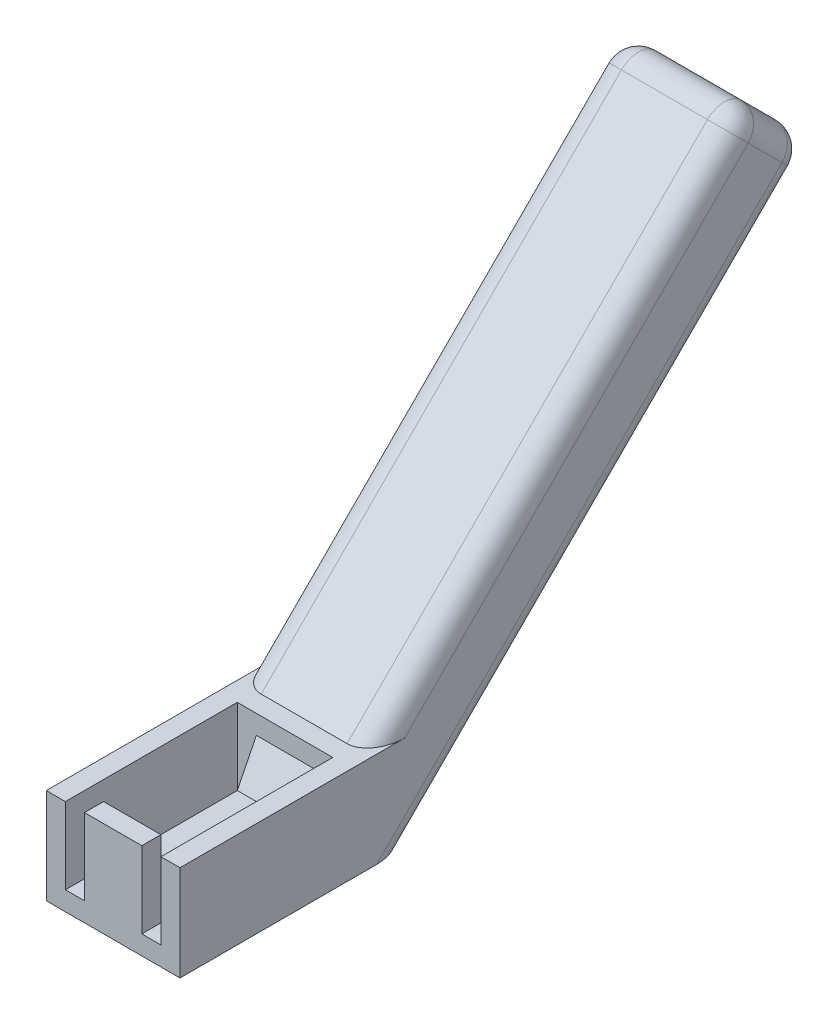
ISO-10303-21;
HEADER;
FILE_DESCRIPTION(('STEP AP214'),'2;1');
FILE_NAME('part.step','',(''),(''),'','','');
FILE_SCHEMA(('AUTOMOTIVE_DESIGN { 1 0 10303 214 1 1 1 1 }'));
ENDSEC;
DATA;
#1=APPLICATION_CONTEXT('core data for automotive mechanical design processes');
#2=APPLICATION_PROTOCOL_DEFINITION('international standard','automotive_design',2000,#1);
#3=PRODUCT_CONTEXT('',#1,'mechanical');
#4=PRODUCT('Part','Part','',(#3));
#5=PRODUCT_RELATED_PRODUCT_CATEGORY('part','',(#4));
#6=PRODUCT_DEFINITION_FORMATION('','',#4);
#7=PRODUCT_DEFINITION_CONTEXT('part definition',#1,'design');
#8=PRODUCT_DEFINITION('design','',#6,#7);
#9=PRODUCT_DEFINITION_SHAPE('','',#8);
#10=(LENGTH_UNIT() NAMED_UNIT(*) SI_UNIT(.MILLI.,.METRE.));
#11=(NAMED_UNIT(*) PLANE_ANGLE_UNIT() SI_UNIT($,.RADIAN.));
#12=(NAMED_UNIT(*) SI_UNIT($,.STERADIAN.) SOLID_ANGLE_UNIT());
#13=UNCERTAINTY_MEASURE_WITH_UNIT(LENGTH_MEASURE(1.E-05),#10,'distance_accuracy_value','');
#14=(GEOMETRIC_REPRESENTATION_CONTEXT(3) GLOBAL_UNCERTAINTY_ASSIGNED_CONTEXT((#13)) GLOBAL_UNIT_ASSIGNED_CONTEXT((#10,
#11,#12)) REPRESENTATION_CONTEXT('',''));
#15=CARTESIAN_POINT('',(0.,0.,0.));
#16=DIRECTION('',(0.,0.,1.));
#17=DIRECTION('',(1.,0.,0.));
#18=AXIS2_PLACEMENT_3D('',#15,#16,#17);
#19=CARTESIAN_POINT('',(-8.75,12.5,5.17766952966368));
#20=DIRECTION('',(0.,1.,0.));
#21=DIRECTION('',(0.,0.,1.));
#22=AXIS2_PLACEMENT_3D('',#19,#20,#21);
#23=PLANE('',#22);
#24=DIRECTION('',(0.,0.,-1.));
#25=VECTOR('',#24,1.);
#26=CARTESIAN_POINT('',(-3.75,12.5,5.17766952966368));
#27=LINE('',#26,#25);
#28=CARTESIAN_POINT('',(-3.75,12.5,30.1776695296637));
#29=VERTEX_POINT('',#28);
#30=CARTESIAN_POINT('',(-3.75,12.5,27.6776695296637));
#31=VERTEX_POINT('',#30);
#32=EDGE_CURVE('E392',#29,#31,#27,.T.);
#33=ORIENTED_EDGE('',*,*,#32,.F.);
#34=DIRECTION('',(1.,0.,0.));
#35=VECTOR('',#34,1.);
#36=CARTESIAN_POINT('',(-8.75,12.5,30.1776695296637));
#37=LINE('',#36,#35);
#38=CARTESIAN_POINT('',(3.75,12.5,30.1776695296637));
#39=VERTEX_POINT('',#38);
#40=EDGE_CURVE('E243',#29,#39,#37,.T.);
#41=ORIENTED_EDGE('',*,*,#40,.T.);
#42=DIRECTION('',(0.,0.,1.));
#43=VECTOR('',#42,1.);
#44=CARTESIAN_POINT('',(3.75,12.5,5.17766952966368));
#45=LINE('',#44,#43);
#46=CARTESIAN_POINT('',(3.75,12.5,27.6776695296637));
#47=VERTEX_POINT('',#46);
#48=EDGE_CURVE('E371',#47,#39,#45,.T.);
#49=ORIENTED_EDGE('',*,*,#48,.F.);
#50=DIRECTION('',(1.,0.,0.));
#51=VECTOR('',#50,1.);
#52=CARTESIAN_POINT('',(-8.75,12.5,27.6776695296637));
#53=LINE('',#52,#51);
#54=EDGE_CURVE('E492',#31,#47,#53,.T.);
#55=ORIENTED_EDGE('',*,*,#54,.F.);
#56=EDGE_LOOP('',(#33,#41,#49,#55));
#57=FACE_BOUND('',#56,.T.);
#58=ADVANCED_FACE('F39',(#57),#23,.T.);
#59=CARTESIAN_POINT('',(-8.75,2.5,7.67766952966368));
#60=DIRECTION('',(0.,1.,0.));
#61=DIRECTION('',(0.,0.,1.));
#62=AXIS2_PLACEMENT_3D('',#59,#60,#61);
#63=PLANE('',#62);
#64=DIRECTION('',(0.,0.,-1.));
#65=VECTOR('',#64,1.);
#66=CARTESIAN_POINT('',(6.25,2.5,7.67766952966368));
#67=LINE('',#66,#65);
#68=CARTESIAN_POINT('',(6.25,2.5,30.1776695296637));
#69=VERTEX_POINT('',#68);
#70=CARTESIAN_POINT('',(6.25,2.5,7.67766952966368));
#71=VERTEX_POINT('',#70);
#72=EDGE_CURVE('E416',#69,#71,#67,.T.);
#73=ORIENTED_EDGE('',*,*,#72,.T.);
#74=DIRECTION('',(1.,0.,0.));
#75=VECTOR('',#74,1.);
#76=CARTESIAN_POINT('',(-8.75,2.5,7.67766952966368));
#77=LINE('',#76,#75);
#78=CARTESIAN_POINT('',(-6.25,2.5,7.67766952966368));
#79=VERTEX_POINT('',#78);
#80=EDGE_CURVE('E457',#79,#71,#77,.T.);
#81=ORIENTED_EDGE('',*,*,#80,.F.);
#82=DIRECTION('',(0.,0.,1.));
#83=VECTOR('',#82,1.);
#84=CARTESIAN_POINT('',(-6.25,2.5,7.67766952966368));
#85=LINE('',#84,#83);
#86=CARTESIAN_POINT('',(-6.25,2.5,30.1776695296637));
#87=VERTEX_POINT('',#86);
#88=EDGE_CURVE('E232',#79,#87,#85,.T.);
#89=ORIENTED_EDGE('',*,*,#88,.T.);
#90=DIRECTION('',(-1.,0.,0.));
#91=VECTOR('',#90,1.);
#92=CARTESIAN_POINT('',(-8.75,2.5,30.1776695296637));
#93=LINE('',#92,#91);
#94=CARTESIAN_POINT('',(-3.75,2.5,30.1776695296637));
#95=VERTEX_POINT('',#94);
#96=EDGE_CURVE('E224',#95,#87,#93,.T.);
#97=ORIENTED_EDGE('',*,*,#96,.F.);
#98=DIRECTION('',(0.,0.,1.));
#99=VECTOR('',#98,1.);
#100=CARTESIAN_POINT('',(-3.75,2.5,7.67766952966368));
#101=LINE('',#100,#99);
#102=CARTESIAN_POINT('',(-3.75,2.5,27.6776695296637));
#103=VERTEX_POINT('',#102);
#104=EDGE_CURVE('E212',#103,#95,#101,.T.);
#105=ORIENTED_EDGE('',*,*,#104,.F.);
#106=DIRECTION('',(1.,0.,0.));
#107=VECTOR('',#106,1.);
#108=CARTESIAN_POINT('',(-8.75,2.5,27.6776695296637));
#109=LINE('',#108,#107);
#110=CARTESIAN_POINT('',(3.75,2.5,27.6776695296637));
#111=VERTEX_POINT('',#110);
#112=EDGE_CURVE('E456',#103,#111,#109,.T.);
#113=ORIENTED_EDGE('',*,*,#112,.T.);
#114=DIRECTION('',(0.,0.,-1.));
#115=VECTOR('',#114,1.);
#116=CARTESIAN_POINT('',(3.75,2.5,7.67766952966367));
#117=LINE('',#116,#115);
#118=CARTESIAN_POINT('',(3.75,2.5,30.1776695296637));
#119=VERTEX_POINT('',#118);
#120=EDGE_CURVE('E355',#119,#111,#117,.T.);
#121=ORIENTED_EDGE('',*,*,#120,.F.);
#122=DIRECTION('',(-1.,0.,0.));
#123=VECTOR('',#122,1.);
#124=CARTESIAN_POINT('',(-8.75000000000003,2.5,30.1776695296637));
#125=LINE('',#124,#123);
#126=EDGE_CURVE('E358',#69,#119,#125,.T.);
#127=ORIENTED_EDGE('',*,*,#126,.F.);
#128=EDGE_LOOP('',(#73,#81,#89,#97,#105,#113,#121,#127));
#129=FACE_BOUND('',#128,.T.);
#130=ADVANCED_FACE('F229',(#129),#63,.T.);
#131=CARTESIAN_POINT('',(-8.75,5.,10.1776695296637));
#132=DIRECTION('',(0.,-1.,0.));
#133=DIRECTION('',(0.,0.,-1.));
#134=AXIS2_PLACEMENT_3D('',#131,#132,#133);
#135=PLANE('',#134);
#136=DIRECTION('',(0.,0.,1.));
#137=VECTOR('',#136,1.);
#138=CARTESIAN_POINT('',(-3.75,5.,10.1776695296637));
#139=LINE('',#138,#137);
#140=CARTESIAN_POINT('',(-3.75,5.00000000000001,7.67766952966368));
#141=VERTEX_POINT('',#140);
#142=CARTESIAN_POINT('',(-3.75,5.,10.1776695296637));
#143=VERTEX_POINT('',#142);
#144=EDGE_CURVE('E409',#141,#143,#139,.T.);
#145=ORIENTED_EDGE('',*,*,#144,.F.);
#146=DIRECTION('',(1.,0.,0.));
#147=VECTOR('',#146,1.);
#148=CARTESIAN_POINT('',(-8.75,5.,7.67766952966368));
#149=LINE('',#148,#147);
#150=CARTESIAN_POINT('',(3.75,5.00000000000001,7.67766952966368));
#151=VERTEX_POINT('',#150);
#152=EDGE_CURVE('E461',#141,#151,#149,.T.);
#153=ORIENTED_EDGE('',*,*,#152,.T.);
#154=DIRECTION('',(0.,0.,-1.));
#155=VECTOR('',#154,1.);
#156=CARTESIAN_POINT('',(3.75,5.,10.1776695296637));
#157=LINE('',#156,#155);
#158=CARTESIAN_POINT('',(3.75,5.,10.1776695296637));
#159=VERTEX_POINT('',#158);
#160=EDGE_CURVE('E389',#159,#151,#157,.T.);
#161=ORIENTED_EDGE('',*,*,#160,.F.);
#162=DIRECTION('',(1.,0.,0.));
#163=VECTOR('',#162,1.);
#164=CARTESIAN_POINT('',(-8.75,5.,10.1776695296637));
#165=LINE('',#164,#163);
#166=EDGE_CURVE('E465',#143,#159,#165,.T.);
#167=ORIENTED_EDGE('',*,*,#166,.F.);
#168=EDGE_LOOP('',(#145,#153,#161,#167));
#169=FACE_BOUND('',#168,.T.);
#170=ADVANCED_FACE('F608',(#169),#135,.T.);
#171=CARTESIAN_POINT('',(-8.75,5.,10.1776695296637));
#172=DIRECTION('',(0.,0.447213595499958,0.894427190999916));
#173=DIRECTION('',(0.,-0.894427190999916,0.447213595499958));
#174=AXIS2_PLACEMENT_3D('',#171,#172,#173);
#175=PLANE('',#174);
#176=DIRECTION('',(0.,0.894427190999916,-0.447213595499958));
#177=VECTOR('',#176,1.);
#178=CARTESIAN_POINT('',(-3.75,5.,10.1776695296637));
#179=LINE('',#178,#177);
#180=CARTESIAN_POINT('',(-3.75,10.,7.67766952966368));
#181=VERTEX_POINT('',#180);
#182=EDGE_CURVE('E406',#143,#181,#179,.T.);
#183=ORIENTED_EDGE('',*,*,#182,.F.);
#184=ORIENTED_EDGE('',*,*,#166,.T.);
#185=DIRECTION('',(0.,-0.894427190999916,0.447213595499958));
#186=VECTOR('',#185,1.);
#187=CARTESIAN_POINT('',(3.75,5.,10.1776695296637));
#188=LINE('',#187,#186);
#189=CARTESIAN_POINT('',(3.75,10.,7.67766952966368));
#190=VERTEX_POINT('',#189);
#191=EDGE_CURVE('E386',#190,#159,#188,.T.);
#192=ORIENTED_EDGE('',*,*,#191,.F.);
#193=DIRECTION('',(1.,0.,0.));
#194=VECTOR('',#193,1.);
#195=CARTESIAN_POINT('',(-8.75,10.,7.67766952966368));
#196=LINE('',#195,#194);
#197=EDGE_CURVE('E469',#181,#190,#196,.T.);
#198=ORIENTED_EDGE('',*,*,#197,.F.);
#199=EDGE_LOOP('',(#183,#184,#192,#198));
#200=FACE_BOUND('',#199,.T.);
#201=ADVANCED_FACE('F778',(#200),#175,.T.);
#202=CARTESIAN_POINT('',(-8.75,12.5,7.67766952966367));
#203=DIRECTION('',(0.,0.,1.));
#204=DIRECTION('',(0.,-1.,0.));
#205=AXIS2_PLACEMENT_3D('',#202,#203,#204);
#206=PLANE('',#205);
#207=ORIENTED_EDGE('',*,*,#152,.F.);
#208=DIRECTION('',(0.,-1.,0.));
#209=VECTOR('',#208,1.);
#210=CARTESIAN_POINT('',(-3.75,61.871843353823,7.67766952966368));
#211=LINE('',#210,#209);
#212=EDGE_CURVE('E237',#181,#141,#211,.T.);
#213=ORIENTED_EDGE('',*,*,#212,.F.);
#214=ORIENTED_EDGE('',*,*,#197,.T.);
#215=DIRECTION('',(0.,-1.,0.));
#216=VECTOR('',#215,1.);
#217=CARTESIAN_POINT('',(3.75,61.871843353823,7.67766952966368));
#218=LINE('',#217,#216);
#219=EDGE_CURVE('E225',#190,#151,#218,.T.);
#220=ORIENTED_EDGE('',*,*,#219,.T.);
#221=EDGE_LOOP('',(#207,#213,#214,#220));
#222=FACE_BOUND('',#221,.T.);
#223=DIRECTION('',(0.,1.,0.));
#224=VECTOR('',#223,1.);
#225=CARTESIAN_POINT('',(6.25,12.5,7.67766952966367));
#226=LINE('',#225,#224);
#227=CARTESIAN_POINT('',(6.25,12.5,7.67766952966367));
#228=VERTEX_POINT('',#227);
#229=EDGE_CURVE('E419',#71,#228,#226,.T.);
#230=ORIENTED_EDGE('',*,*,#229,.T.);
#231=DIRECTION('',(1.,0.,0.));
#232=VECTOR('',#231,1.);
#233=CARTESIAN_POINT('',(-8.75,12.5,7.67766952966367));
#234=LINE('',#233,#232);
#235=CARTESIAN_POINT('',(-6.25,12.5,7.67766952966367));
#236=VERTEX_POINT('',#235);
#237=EDGE_CURVE('E473',#236,#228,#234,.T.);
#238=ORIENTED_EDGE('',*,*,#237,.F.);
#239=DIRECTION('',(0.,-1.,0.));
#240=VECTOR('',#239,1.);
#241=CARTESIAN_POINT('',(-6.25,12.5,7.67766952966367));
#242=LINE('',#241,#240);
#243=EDGE_CURVE('E429',#236,#79,#242,.T.);
#244=ORIENTED_EDGE('',*,*,#243,.T.);
#245=ORIENTED_EDGE('',*,*,#80,.T.);
#246=EDGE_LOOP('',(#230,#238,#244,#245));
#247=FACE_BOUND('',#246,.T.);
#248=ADVANCED_FACE('F772',(#222,#247),#206,.T.);
#249=CARTESIAN_POINT('',(-8.75,10.,27.6776695296637));
#250=DIRECTION('',(0.,0.,-1.));
#251=DIRECTION('',(-1.,0.,0.));
#252=AXIS2_PLACEMENT_3D('',#249,#250,#251);
#253=PLANE('',#252);
#254=DIRECTION('',(0.,-1.,0.));
#255=VECTOR('',#254,1.);
#256=CARTESIAN_POINT('',(-3.75,10.,27.6776695296637));
#257=LINE('',#256,#255);
#258=CARTESIAN_POINT('',(-3.75,10.,27.6776695296637));
#259=VERTEX_POINT('',#258);
#260=EDGE_CURVE('E395',#31,#259,#257,.T.);
#261=ORIENTED_EDGE('',*,*,#260,.F.);
#262=ORIENTED_EDGE('',*,*,#54,.T.);
#263=DIRECTION('',(0.,1.,0.));
#264=VECTOR('',#263,1.);
#265=CARTESIAN_POINT('',(3.75,10.,27.6776695296637));
#266=LINE('',#265,#264);
#267=CARTESIAN_POINT('',(3.75,10.,27.6776695296637));
#268=VERTEX_POINT('',#267);
#269=EDGE_CURVE('E374',#268,#47,#266,.T.);
#270=ORIENTED_EDGE('',*,*,#269,.F.);
#271=DIRECTION('',(1.,0.,0.));
#272=VECTOR('',#271,1.);
#273=CARTESIAN_POINT('',(-8.75,10.,27.6776695296637));
#274=LINE('',#273,#272);
#275=EDGE_CURVE('E496',#259,#268,#274,.T.);
#276=ORIENTED_EDGE('',*,*,#275,.F.);
#277=EDGE_LOOP('',(#261,#262,#270,#276));
#278=FACE_BOUND('',#277,.T.);
#279=ADVANCED_FACE('F534',(#278),#253,.T.);
#280=CARTESIAN_POINT('',(-8.75,5.,25.1776695296637));
#281=DIRECTION('',(0.,0.447213595499958,-0.894427190999916));
#282=DIRECTION('',(0.,0.894427190999916,0.447213595499958));
#283=AXIS2_PLACEMENT_3D('',#280,#281,#282);
#284=PLANE('',#283);
#285=DIRECTION('',(0.,-0.894427190999916,-0.447213595499958));
#286=VECTOR('',#285,1.);
#287=CARTESIAN_POINT('',(-3.75,5.,25.1776695296637));
#288=LINE('',#287,#286);
#289=CARTESIAN_POINT('',(-3.75,5.,25.1776695296637));
#290=VERTEX_POINT('',#289);
#291=EDGE_CURVE('E398',#259,#290,#288,.T.);
#292=ORIENTED_EDGE('',*,*,#291,.F.);
#293=ORIENTED_EDGE('',*,*,#275,.T.);
#294=DIRECTION('',(0.,0.894427190999916,0.447213595499958));
#295=VECTOR('',#294,1.);
#296=CARTESIAN_POINT('',(3.75,5.,25.1776695296637));
#297=LINE('',#296,#295);
#298=CARTESIAN_POINT('',(3.75,5.,25.1776695296637));
#299=VERTEX_POINT('',#298);
#300=EDGE_CURVE('E377',#299,#268,#297,.T.);
#301=ORIENTED_EDGE('',*,*,#300,.F.);
#302=DIRECTION('',(1.,0.,0.));
#303=VECTOR('',#302,1.);
#304=CARTESIAN_POINT('',(-8.75,5.,25.1776695296637));
#305=LINE('',#304,#303);
#306=EDGE_CURVE('E500',#290,#299,#305,.T.);
#307=ORIENTED_EDGE('',*,*,#306,.F.);
#308=EDGE_LOOP('',(#292,#293,#301,#307));
#309=FACE_BOUND('',#308,.T.);
#310=ADVANCED_FACE('F529',(#309),#284,.T.);
#311=CARTESIAN_POINT('',(-8.75,5.,27.6776695296637));
#312=DIRECTION('',(0.,-1.,0.));
#313=DIRECTION('',(0.,0.,-1.));
#314=AXIS2_PLACEMENT_3D('',#311,#312,#313);
#315=PLANE('',#314);
#316=DIRECTION('',(0.,0.,1.));
#317=VECTOR('',#316,1.);
#318=CARTESIAN_POINT('',(-3.75,5.,27.6776695296637));
#319=LINE('',#318,#317);
#320=CARTESIAN_POINT('',(-3.75,5.,27.6776695296637));
#321=VERTEX_POINT('',#320);
#322=EDGE_CURVE('E401',#290,#321,#319,.T.);
#323=ORIENTED_EDGE('',*,*,#322,.F.);
#324=ORIENTED_EDGE('',*,*,#306,.T.);
#325=DIRECTION('',(0.,0.,-1.));
#326=VECTOR('',#325,1.);
#327=CARTESIAN_POINT('',(3.75,5.,27.6776695296637));
#328=LINE('',#327,#326);
#329=CARTESIAN_POINT('',(3.75,5.,27.6776695296637));
#330=VERTEX_POINT('',#329);
#331=EDGE_CURVE('E380',#330,#299,#328,.T.);
#332=ORIENTED_EDGE('',*,*,#331,.F.);
#333=DIRECTION('',(1.,0.,0.));
#334=VECTOR('',#333,1.);
#335=CARTESIAN_POINT('',(-8.75,5.,27.6776695296637));
#336=LINE('',#335,#334);
#337=EDGE_CURVE('E504',#321,#330,#336,.T.);
#338=ORIENTED_EDGE('',*,*,#337,.F.);
#339=EDGE_LOOP('',(#323,#324,#332,#338));
#340=FACE_BOUND('',#339,.T.);
#341=ADVANCED_FACE('F525',(#340),#315,.T.);
#342=CARTESIAN_POINT('',(-8.75,2.5,27.6776695296637));
#343=DIRECTION('',(0.,0.,-1.));
#344=DIRECTION('',(-1.,0.,0.));
#345=AXIS2_PLACEMENT_3D('',#342,#343,#344);
#346=PLANE('',#345);
#347=DIRECTION('',(0.,-1.,0.));
#348=VECTOR('',#347,1.);
#349=CARTESIAN_POINT('',(-3.75,2.5,27.6776695296637));
#350=LINE('',#349,#348);
#351=EDGE_CURVE('E219',#321,#103,#350,.T.);
#352=ORIENTED_EDGE('',*,*,#351,.F.);
#353=ORIENTED_EDGE('',*,*,#337,.T.);
#354=DIRECTION('',(0.,1.,0.));
#355=VECTOR('',#354,1.);
#356=CARTESIAN_POINT('',(3.75,2.5,27.6776695296637));
#357=LINE('',#356,#355);
#358=EDGE_CURVE('E383',#111,#330,#357,.T.);
#359=ORIENTED_EDGE('',*,*,#358,.F.);
#360=ORIENTED_EDGE('',*,*,#112,.F.);
#361=EDGE_LOOP('',(#352,#353,#359,#360));
#362=FACE_BOUND('',#361,.T.);
#363=ADVANCED_FACE('F519',(#362),#346,.T.);
#364=CARTESIAN_POINT('',(-8.75,12.5,30.1776695296637));
#365=VERTEX_POINT('',#364);
#366=CARTESIAN_POINT('',(-6.25,12.5,30.1776695296637));
#367=VERTEX_POINT('',#366);
#368=EDGE_CURVE('E487',#365,#367,#37,.T.);
#369=ORIENTED_EDGE('',*,*,#368,.T.);
#370=DIRECTION('',(0.,0.,-1.));
#371=VECTOR('',#370,1.);
#372=CARTESIAN_POINT('',(-6.25,12.5,42.9252183136456));
#373=LINE('',#372,#371);
#374=EDGE_CURVE('E423',#367,#236,#373,.T.);
#375=ORIENTED_EDGE('',*,*,#374,.T.);
#376=ORIENTED_EDGE('',*,*,#237,.T.);
#377=DIRECTION('',(0.,0.,-1.));
#378=VECTOR('',#377,1.);
#379=CARTESIAN_POINT('',(6.25,12.5,42.9252183136456));
#380=LINE('',#379,#378);
#381=CARTESIAN_POINT('',(6.25,12.5,30.1776695296637));
#382=VERTEX_POINT('',#381);
#383=EDGE_CURVE('E412',#382,#228,#380,.T.);
#384=ORIENTED_EDGE('',*,*,#383,.F.);
#385=CARTESIAN_POINT('',(8.75,12.5,30.1776695296637));
#386=VERTEX_POINT('',#385);
#387=EDGE_CURVE('E491',#382,#386,#37,.T.);
#388=ORIENTED_EDGE('',*,*,#387,.T.);
#389=DIRECTION('',(0.,0.,1.));
#390=VECTOR('',#389,1.);
#391=CARTESIAN_POINT('',(8.75,12.5,27.6776695296637));
#392=LINE('',#391,#390);
#393=CARTESIAN_POINT('',(8.75,12.5,0.758252147247746));
#394=VERTEX_POINT('',#393);
#395=EDGE_CURVE('E432',#394,#386,#392,.T.);
#396=ORIENTED_EDGE('',*,*,#395,.F.);
#397=CARTESIAN_POINT('',(5.625,12.5,0.758252147247753));
#398=DIRECTION('',(0.,1.,0.));
#399=DIRECTION('',(0.,0.,-1.));
#400=AXIS2_PLACEMENT_3D('',#397,#398,#399);
#401=ELLIPSE('',#400,4.41941738241592,3.125);
#402=CARTESIAN_POINT('',(5.625,12.5,5.17766952966368));
#403=VERTEX_POINT('',#402);
#404=EDGE_CURVE('E11',#394,#403,#401,.F.);
#405=ORIENTED_EDGE('',*,*,#404,.T.);
#406=DIRECTION('',(1.,0.,0.));
#407=VECTOR('',#406,1.);
#408=CARTESIAN_POINT('',(-8.75,12.5,5.17766952966368));
#409=LINE('',#408,#407);
#410=CARTESIAN_POINT('',(-5.625,12.5,5.17766952966368));
#411=VERTEX_POINT('',#410);
#412=EDGE_CURVE('E476',#411,#403,#409,.T.);
#413=ORIENTED_EDGE('',*,*,#412,.F.);
#414=CARTESIAN_POINT('',(-5.625,12.5,0.758252147247763));
#415=DIRECTION('',(0.,1.,0.));
#416=DIRECTION('',(0.,0.,1.));
#417=AXIS2_PLACEMENT_3D('',#414,#415,#416);
#418=ELLIPSE('',#417,4.41941738241592,3.125);
#419=CARTESIAN_POINT('',(-8.75,12.5,0.758252147247757));
#420=VERTEX_POINT('',#419);
#421=EDGE_CURVE('E49',#411,#420,#418,.F.);
#422=ORIENTED_EDGE('',*,*,#421,.T.);
#423=DIRECTION('',(0.,0.,1.));
#424=VECTOR('',#423,1.);
#425=CARTESIAN_POINT('',(-8.75,12.5,27.6776695296637));
#426=LINE('',#425,#424);
#427=EDGE_CURVE('E444',#420,#365,#426,.T.);
#428=ORIENTED_EDGE('',*,*,#427,.T.);
#429=EDGE_LOOP('',(#369,#375,#376,#384,#388,#396,#405,#413,#422,#428));
#430=FACE_BOUND('',#429,.T.);
#431=ADVANCED_FACE('F540',(#430),#23,.T.);
#432=CARTESIAN_POINT('',(-8.75,61.871843353823,-44.1941738241591));
#433=DIRECTION('',(0.,0.707106781186546,0.707106781186549));
#434=DIRECTION('',(0.,-0.707106781186549,0.707106781186546));
#435=AXIS2_PLACEMENT_3D('',#432,#433,#434);
#436=PLANE('',#435);
#437=DIRECTION('',(1.,0.,0.));
#438=VECTOR('',#437,1.);
#439=CARTESIAN_POINT('',(-8.75,59.662134662615,-41.9844651329511));
#440=LINE('',#439,#438);
#441=CARTESIAN_POINT('',(5.625,59.662134662615,-41.9844651329511));
#442=VERTEX_POINT('',#441);
#443=CARTESIAN_POINT('',(-5.625,59.662134662615,-41.9844651329511));
#444=VERTEX_POINT('',#443);
#445=EDGE_CURVE('E268',#442,#444,#440,.F.);
#446=ORIENTED_EDGE('',*,*,#445,.T.);
#447=DIRECTION('',(0.,-0.707106781186549,0.707106781186546));
#448=VECTOR('',#447,1.);
#449=CARTESIAN_POINT('',(-5.625,61.871843353823,-44.1941738241591));
#450=LINE('',#449,#448);
#451=EDGE_CURVE('E272',#444,#411,#450,.T.);
#452=ORIENTED_EDGE('',*,*,#451,.T.);
#453=ORIENTED_EDGE('',*,*,#412,.T.);
#454=DIRECTION('',(0.,-0.707106781186549,0.707106781186546));
#455=VECTOR('',#454,1.);
#456=CARTESIAN_POINT('',(5.625,61.871843353823,-44.1941738241591));
#457=LINE('',#456,#455);
#458=EDGE_CURVE('E265',#403,#442,#457,.F.);
#459=ORIENTED_EDGE('',*,*,#458,.T.);
#460=EDGE_LOOP('',(#446,#452,#453,#459));
#461=FACE_BOUND('',#460,.T.);
#462=ADVANCED_FACE('F583',(#461),#436,.T.);
#463=CARTESIAN_POINT('',(-8.75,53.0330085889912,-53.033008588991));
#464=DIRECTION('',(0.,0.70710678118655,-0.707106781186546));
#465=DIRECTION('',(0.,0.707106781186546,0.70710678118655));
#466=AXIS2_PLACEMENT_3D('',#463,#464,#465);
#467=PLANE('',#466);
#468=DIRECTION('',(0.,0.707106781186546,0.70710678118655));
#469=VECTOR('',#468,1.);
#470=CARTESIAN_POINT('',(-5.625,53.0330085889912,-53.033008588991));
#471=LINE('',#470,#469);
#472=CARTESIAN_POINT('',(-5.625,55.2427172801991,-50.823299897783));
#473=VERTEX_POINT('',#472);
#474=CARTESIAN_POINT('',(-5.625,59.662134662615,-46.4038825153671));
#475=VERTEX_POINT('',#474);
#476=EDGE_CURVE('E250',#473,#475,#471,.T.);
#477=ORIENTED_EDGE('',*,*,#476,.T.);
#478=DIRECTION('',(1.,0.,0.));
#479=VECTOR('',#478,1.);
#480=CARTESIAN_POINT('',(-8.75,59.662134662615,-46.4038825153671));
#481=LINE('',#480,#479);
#482=CARTESIAN_POINT('',(5.625,59.662134662615,-46.4038825153671));
#483=VERTEX_POINT('',#482);
#484=EDGE_CURVE('E261',#475,#483,#481,.T.);
#485=ORIENTED_EDGE('',*,*,#484,.T.);
#486=DIRECTION('',(0.,0.707106781186546,0.70710678118655));
#487=VECTOR('',#486,1.);
#488=CARTESIAN_POINT('',(5.625,53.0330085889912,-53.033008588991));
#489=LINE('',#488,#487);
#490=CARTESIAN_POINT('',(5.625,55.2427172801991,-50.823299897783));
#491=VERTEX_POINT('',#490);
#492=EDGE_CURVE('E258',#483,#491,#489,.F.);
#493=ORIENTED_EDGE('',*,*,#492,.T.);
#494=DIRECTION('',(1.,0.,0.));
#495=VECTOR('',#494,1.);
#496=CARTESIAN_POINT('',(-8.75,55.2427172801991,-50.823299897783));
#497=LINE('',#496,#495);
#498=EDGE_CURVE('E245',#491,#473,#497,.F.);
#499=ORIENTED_EDGE('',*,*,#498,.T.);
#500=EDGE_LOOP('',(#477,#485,#493,#499));
#501=FACE_BOUND('',#500,.T.);
#502=ADVANCED_FACE('F617',(#501),#467,.T.);
#503=CARTESIAN_POINT('',(-8.75,0.,0.));
#504=DIRECTION('',(0.,-0.707106781186546,-0.707106781186549));
#505=DIRECTION('',(0.,0.707106781186549,-0.707106781186546));
#506=AXIS2_PLACEMENT_3D('',#503,#504,#505);
#507=PLANE('',#506);
#508=DIRECTION('',(1.,0.,0.));
#509=VECTOR('',#508,1.);
#510=CARTESIAN_POINT('',(-8.75,50.8232998977832,-50.823299897783));
#511=LINE('',#510,#509);
#512=CARTESIAN_POINT('',(-5.625,50.8232998977832,-50.823299897783));
#513=VERTEX_POINT('',#512);
#514=CARTESIAN_POINT('',(5.625,50.8232998977832,-50.823299897783));
#515=VERTEX_POINT('',#514);
#516=EDGE_CURVE('E57',#513,#515,#511,.T.);
#517=ORIENTED_EDGE('',*,*,#516,.T.);
#518=DIRECTION('',(0.,0.707106781186549,-0.707106781186546));
#519=VECTOR('',#518,1.);
#520=CARTESIAN_POINT('',(5.625,0.,0.));
#521=LINE('',#520,#519);
#522=CARTESIAN_POINT('',(5.625,0.,0.));
#523=VERTEX_POINT('',#522);
#524=EDGE_CURVE('E298',#515,#523,#521,.F.);
#525=ORIENTED_EDGE('',*,*,#524,.T.);
#526=DIRECTION('',(1.,0.,0.));
#527=VECTOR('',#526,1.);
#528=CARTESIAN_POINT('',(-8.75,0.,0.));
#529=LINE('',#528,#527);
#530=CARTESIAN_POINT('',(-5.625,0.,0.));
#531=VERTEX_POINT('',#530);
#532=EDGE_CURVE('E480',#531,#523,#529,.T.);
#533=ORIENTED_EDGE('',*,*,#532,.F.);
#534=DIRECTION('',(0.,0.707106781186549,-0.707106781186546));
#535=VECTOR('',#534,1.);
#536=CARTESIAN_POINT('',(-5.625,0.,0.));
#537=LINE('',#536,#535);
#538=EDGE_CURVE('E62',#531,#513,#537,.T.);
#539=ORIENTED_EDGE('',*,*,#538,.T.);
#540=EDGE_LOOP('',(#517,#525,#533,#539));
#541=FACE_BOUND('',#540,.T.);
#542=ADVANCED_FACE('F558',(#541),#507,.T.);
#543=CARTESIAN_POINT('',(-8.75,0.,30.1776695296637));
#544=DIRECTION('',(0.,-1.,0.));
#545=DIRECTION('',(0.,0.,-1.));
#546=AXIS2_PLACEMENT_3D('',#543,#544,#545);
#547=PLANE('',#546);
#548=ORIENTED_EDGE('',*,*,#532,.T.);
#549=CARTESIAN_POINT('',(5.625,0.,4.41941738241591));
#550=DIRECTION('',(0.,-1.,0.));
#551=DIRECTION('',(0.,0.,1.));
#552=AXIS2_PLACEMENT_3D('',#549,#550,#551);
#553=ELLIPSE('',#552,4.41941738241591,3.125);
#554=CARTESIAN_POINT('',(8.75,0.,4.41941738241591));
#555=VERTEX_POINT('',#554);
#556=EDGE_CURVE('E304',#523,#555,#553,.T.);
#557=ORIENTED_EDGE('',*,*,#556,.T.);
#558=DIRECTION('',(0.,0.,-1.));
#559=VECTOR('',#558,1.);
#560=CARTESIAN_POINT('',(8.75,0.,30.1776695296637));
#561=LINE('',#560,#559);
#562=CARTESIAN_POINT('',(8.75,0.,30.1776695296637));
#563=VERTEX_POINT('',#562);
#564=EDGE_CURVE('E440',#563,#555,#561,.T.);
#565=ORIENTED_EDGE('',*,*,#564,.F.);
#566=DIRECTION('',(1.,0.,0.));
#567=VECTOR('',#566,1.);
#568=CARTESIAN_POINT('',(-8.75,0.,30.1776695296637));
#569=LINE('',#568,#567);
#570=CARTESIAN_POINT('',(-8.75,0.,30.1776695296637));
#571=VERTEX_POINT('',#570);
#572=EDGE_CURVE('E484',#571,#563,#569,.T.);
#573=ORIENTED_EDGE('',*,*,#572,.F.);
#574=DIRECTION('',(0.,0.,-1.));
#575=VECTOR('',#574,1.);
#576=CARTESIAN_POINT('',(-8.75,0.,30.1776695296637));
#577=LINE('',#576,#575);
#578=CARTESIAN_POINT('',(-8.75,0.,4.41941738241591));
#579=VERTEX_POINT('',#578);
#580=EDGE_CURVE('E452',#571,#579,#577,.T.);
#581=ORIENTED_EDGE('',*,*,#580,.T.);
#582=CARTESIAN_POINT('',(-5.625,0.,4.41941738241591));
#583=DIRECTION('',(0.,-1.,0.));
#584=DIRECTION('',(0.,0.,-1.));
#585=AXIS2_PLACEMENT_3D('',#582,#583,#584);
#586=ELLIPSE('',#585,4.41941738241591,3.125);
#587=EDGE_CURVE('E301',#579,#531,#586,.T.);
#588=ORIENTED_EDGE('',*,*,#587,.T.);
#589=EDGE_LOOP('',(#548,#557,#565,#573,#581,#588));
#590=FACE_BOUND('',#589,.T.);
#591=ADVANCED_FACE('F550',(#590),#547,.T.);
#592=CARTESIAN_POINT('',(-8.75,12.5,30.1776695296637));
#593=DIRECTION('',(0.,0.,1.));
#594=DIRECTION('',(0.,-1.,0.));
#595=AXIS2_PLACEMENT_3D('',#592,#593,#594);
#596=PLANE('',#595);
#597=DIRECTION('',(0.,1.,0.));
#598=VECTOR('',#597,1.);
#599=CARTESIAN_POINT('',(-3.75,12.5,30.1776695296637));
#600=LINE('',#599,#598);
#601=EDGE_CURVE('E216',#95,#29,#600,.T.);
#602=ORIENTED_EDGE('',*,*,#601,.F.);
#603=ORIENTED_EDGE('',*,*,#96,.T.);
#604=DIRECTION('',(0.,-1.,0.));
#605=VECTOR('',#604,1.);
#606=CARTESIAN_POINT('',(-6.25,12.5,30.1776695296637));
#607=LINE('',#606,#605);
#608=EDGE_CURVE('E246',#367,#87,#607,.T.);
#609=ORIENTED_EDGE('',*,*,#608,.F.);
#610=ORIENTED_EDGE('',*,*,#368,.F.);
#611=DIRECTION('',(0.,-1.,0.));
#612=VECTOR('',#611,1.);
#613=CARTESIAN_POINT('',(-8.75,12.5,30.1776695296637));
#614=LINE('',#613,#612);
#615=EDGE_CURVE('E448',#365,#571,#614,.T.);
#616=ORIENTED_EDGE('',*,*,#615,.T.);
#617=ORIENTED_EDGE('',*,*,#572,.T.);
#618=DIRECTION('',(0.,-1.,0.));
#619=VECTOR('',#618,1.);
#620=CARTESIAN_POINT('',(8.75,12.5,30.1776695296637));
#621=LINE('',#620,#619);
#622=EDGE_CURVE('E436',#386,#563,#621,.T.);
#623=ORIENTED_EDGE('',*,*,#622,.F.);
#624=ORIENTED_EDGE('',*,*,#387,.F.);
#625=DIRECTION('',(0.,1.,0.));
#626=VECTOR('',#625,1.);
#627=CARTESIAN_POINT('',(6.25,12.5,30.1776695296637));
#628=LINE('',#627,#626);
#629=EDGE_CURVE('E460',#69,#382,#628,.T.);
#630=ORIENTED_EDGE('',*,*,#629,.F.);
#631=ORIENTED_EDGE('',*,*,#126,.T.);
#632=DIRECTION('',(0.,-1.,0.));
#633=VECTOR('',#632,1.);
#634=CARTESIAN_POINT('',(3.75,12.5,30.1776695296637));
#635=LINE('',#634,#633);
#636=EDGE_CURVE('E252',#39,#119,#635,.T.);
#637=ORIENTED_EDGE('',*,*,#636,.F.);
#638=ORIENTED_EDGE('',*,*,#40,.F.);
#639=EDGE_LOOP('',(#602,#603,#609,#610,#616,#617,#623,#624,#630,#631,#637,#638));
#640=FACE_BOUND('',#639,.T.);
#641=ADVANCED_FACE('F240',(#640),#596,.T.);
#642=CARTESIAN_POINT('',(-8.75,0.,0.));
#643=DIRECTION('',(-1.,0.,0.));
#644=DIRECTION('',(0.,0.,1.));
#645=AXIS2_PLACEMENT_3D('',#642,#643,#644);
#646=PLANE('',#645);
#647=DIRECTION('',(0.,0.707106781186546,0.70710678118655));
#648=VECTOR('',#647,1.);
#649=CARTESIAN_POINT('',(-8.75,50.8232998977832,-50.823299897783));
#650=LINE('',#649,#648);
#651=CARTESIAN_POINT('',(-8.75,57.4524259714071,-44.1941738241591));
#652=VERTEX_POINT('',#651);
#653=CARTESIAN_POINT('',(-8.75,53.0330085889912,-48.613591206575));
#654=VERTEX_POINT('',#653);
#655=EDGE_CURVE('E288',#652,#654,#650,.F.);
#656=ORIENTED_EDGE('',*,*,#655,.T.);
#657=DIRECTION('',(0.,0.707106781186549,-0.707106781186546));
#658=VECTOR('',#657,1.);
#659=CARTESIAN_POINT('',(-8.75,2.20970869120796,2.20970869120797));
#660=LINE('',#659,#658);
#661=EDGE_CURVE('E291',#654,#579,#660,.F.);
#662=ORIENTED_EDGE('',*,*,#661,.T.);
#663=ORIENTED_EDGE('',*,*,#580,.F.);
#664=ORIENTED_EDGE('',*,*,#615,.F.);
#665=ORIENTED_EDGE('',*,*,#427,.F.);
#666=DIRECTION('',(0.,-0.707106781186549,0.707106781186546));
#667=VECTOR('',#666,1.);
#668=CARTESIAN_POINT('',(-8.75,6.62912607362385,6.62912607362389));
#669=LINE('',#668,#667);
#670=EDGE_CURVE('E285',#420,#652,#669,.F.);
#671=ORIENTED_EDGE('',*,*,#670,.T.);
#672=EDGE_LOOP('',(#656,#662,#663,#664,#665,#671));
#673=FACE_BOUND('',#672,.T.);
#674=ADVANCED_FACE('F553',(#673),#646,.T.);
#675=CARTESIAN_POINT('',(8.75,0.,0.));
#676=DIRECTION('',(-1.,0.,0.));
#677=DIRECTION('',(0.,0.,1.));
#678=AXIS2_PLACEMENT_3D('',#675,#676,#677);
#679=PLANE('',#678);
#680=ORIENTED_EDGE('',*,*,#564,.T.);
#681=DIRECTION('',(0.,0.707106781186549,-0.707106781186546));
#682=VECTOR('',#681,1.);
#683=CARTESIAN_POINT('',(8.75,55.2427172801991,-50.823299897783));
#684=LINE('',#683,#682);
#685=CARTESIAN_POINT('',(8.75,53.0330085889912,-48.613591206575));
#686=VERTEX_POINT('',#685);
#687=EDGE_CURVE('E282',#555,#686,#684,.T.);
#688=ORIENTED_EDGE('',*,*,#687,.T.);
#689=DIRECTION('',(0.,0.707106781186546,0.70710678118655));
#690=VECTOR('',#689,1.);
#691=CARTESIAN_POINT('',(8.75,59.662134662615,-41.9844651329511));
#692=LINE('',#691,#690);
#693=CARTESIAN_POINT('',(8.75,57.4524259714071,-44.1941738241591));
#694=VERTEX_POINT('',#693);
#695=EDGE_CURVE('E279',#686,#694,#692,.T.);
#696=ORIENTED_EDGE('',*,*,#695,.T.);
#697=DIRECTION('',(0.,-0.707106781186549,0.707106781186546));
#698=VECTOR('',#697,1.);
#699=CARTESIAN_POINT('',(8.75,10.290291308792,2.96796083845571));
#700=LINE('',#699,#698);
#701=EDGE_CURVE('E275',#694,#394,#700,.T.);
#702=ORIENTED_EDGE('',*,*,#701,.T.);
#703=ORIENTED_EDGE('',*,*,#395,.T.);
#704=ORIENTED_EDGE('',*,*,#622,.T.);
#705=EDGE_LOOP('',(#680,#688,#696,#702,#703,#704));
#706=FACE_BOUND('',#705,.T.);
#707=ADVANCED_FACE('F543',(#706),#679,.F.);
#708=CARTESIAN_POINT('',(-6.25,0.,42.9252183136456));
#709=DIRECTION('',(-1.,0.,0.));
#710=DIRECTION('',(0.,0.,1.));
#711=AXIS2_PLACEMENT_3D('',#708,#709,#710);
#712=PLANE('',#711);
#713=ORIENTED_EDGE('',*,*,#88,.F.);
#714=ORIENTED_EDGE('',*,*,#243,.F.);
#715=ORIENTED_EDGE('',*,*,#374,.F.);
#716=ORIENTED_EDGE('',*,*,#608,.T.);
#717=EDGE_LOOP('',(#713,#714,#715,#716));
#718=FACE_BOUND('',#717,.T.);
#719=ADVANCED_FACE('F752',(#718),#712,.F.);
#720=CARTESIAN_POINT('',(6.25,0.,42.9252183136456));
#721=DIRECTION('',(1.,0.,0.));
#722=DIRECTION('',(0.,0.,-1.));
#723=AXIS2_PLACEMENT_3D('',#720,#721,#722);
#724=PLANE('',#723);
#725=ORIENTED_EDGE('',*,*,#229,.F.);
#726=ORIENTED_EDGE('',*,*,#72,.F.);
#727=ORIENTED_EDGE('',*,*,#629,.T.);
#728=ORIENTED_EDGE('',*,*,#383,.T.);
#729=EDGE_LOOP('',(#725,#726,#727,#728));
#730=FACE_BOUND('',#729,.T.);
#731=ADVANCED_FACE('F744',(#730),#724,.F.);
#732=CARTESIAN_POINT('',(3.75,61.871843353823,7.67766952966367));
#733=DIRECTION('',(-1.,0.,0.));
#734=DIRECTION('',(0.,0.,1.));
#735=AXIS2_PLACEMENT_3D('',#732,#733,#734);
#736=PLANE('',#735);
#737=ORIENTED_EDGE('',*,*,#358,.T.);
#738=ORIENTED_EDGE('',*,*,#331,.T.);
#739=ORIENTED_EDGE('',*,*,#300,.T.);
#740=ORIENTED_EDGE('',*,*,#269,.T.);
#741=ORIENTED_EDGE('',*,*,#48,.T.);
#742=ORIENTED_EDGE('',*,*,#636,.T.);
#743=ORIENTED_EDGE('',*,*,#120,.T.);
#744=EDGE_LOOP('',(#737,#738,#739,#740,#741,#742,#743));
#745=FACE_BOUND('',#744,.T.);
#746=ADVANCED_FACE('F513',(#745),#736,.F.);
#747=CARTESIAN_POINT('',(-3.75,61.871843353823,7.67766952966368));
#748=DIRECTION('',(1.,0.,0.));
#749=DIRECTION('',(0.,0.,-1.));
#750=AXIS2_PLACEMENT_3D('',#747,#748,#749);
#751=PLANE('',#750);
#752=ORIENTED_EDGE('',*,*,#351,.T.);
#753=ORIENTED_EDGE('',*,*,#104,.T.);
#754=ORIENTED_EDGE('',*,*,#601,.T.);
#755=ORIENTED_EDGE('',*,*,#32,.T.);
#756=ORIENTED_EDGE('',*,*,#260,.T.);
#757=ORIENTED_EDGE('',*,*,#291,.T.);
#758=ORIENTED_EDGE('',*,*,#322,.T.);
#759=EDGE_LOOP('',(#752,#753,#754,#755,#756,#757,#758));
#760=FACE_BOUND('',#759,.T.);
#761=ADVANCED_FACE('F214',(#760),#751,.F.);
#762=ORIENTED_EDGE('',*,*,#160,.T.);
#763=ORIENTED_EDGE('',*,*,#219,.F.);
#764=ORIENTED_EDGE('',*,*,#191,.T.);
#765=EDGE_LOOP('',(#762,#763,#764));
#766=FACE_BOUND('',#765,.T.);
#767=ADVANCED_FACE('F721',(#766),#736,.F.);
#768=ORIENTED_EDGE('',*,*,#144,.T.);
#769=ORIENTED_EDGE('',*,*,#182,.T.);
#770=ORIENTED_EDGE('',*,*,#212,.T.);
#771=EDGE_LOOP('',(#768,#769,#770));
#772=FACE_BOUND('',#771,.T.);
#773=ADVANCED_FACE('F713',(#772),#751,.F.);
#774=CARTESIAN_POINT('',(-5.625,2.20970869120796,2.20970869120797));
#775=DIRECTION('',(0.,0.707106781186549,-0.707106781186546));
#776=DIRECTION('',(0.,0.707106781186546,0.707106781186549));
#777=AXIS2_PLACEMENT_3D('',#774,#775,#776);
#778=CYLINDRICAL_SURFACE('',#777,3.125);
#779=ORIENTED_EDGE('',*,*,#587,.F.);
#780=ORIENTED_EDGE('',*,*,#661,.F.);
#781=CARTESIAN_POINT('',(-5.625,53.0330085889911,-48.613591206575));
#782=DIRECTION('',(0.,0.707106781186549,-0.707106781186546));
#783=DIRECTION('',(0.,0.707106781186546,0.707106781186549));
#784=AXIS2_PLACEMENT_3D('',#781,#782,#783);
#785=CIRCLE('',#784,3.125);
#786=EDGE_CURVE('E43',#513,#654,#785,.T.);
#787=ORIENTED_EDGE('',*,*,#786,.F.);
#788=ORIENTED_EDGE('',*,*,#538,.F.);
#789=EDGE_LOOP('',(#779,#780,#787,#788));
#790=FACE_BOUND('',#789,.T.);
#791=ADVANCED_FACE('F41',(#790),#778,.T.);
#792=CARTESIAN_POINT('',(-8.75,53.0330085889911,-48.613591206575));
#793=DIRECTION('',(1.,0.,0.));
#794=DIRECTION('',(0.,0.,-1.));
#795=AXIS2_PLACEMENT_3D('',#792,#793,#794);
#796=CYLINDRICAL_SURFACE('',#795,3.125);
#797=CARTESIAN_POINT('',(5.625,53.0330085889911,-48.613591206575));
#798=DIRECTION('',(1.,0.,0.));
#799=DIRECTION('',(0.,0.,-1.));
#800=AXIS2_PLACEMENT_3D('',#797,#798,#799);
#801=CIRCLE('',#800,3.125);
#802=EDGE_CURVE('E344',#515,#491,#801,.T.);
#803=ORIENTED_EDGE('',*,*,#802,.F.);
#804=ORIENTED_EDGE('',*,*,#516,.F.);
#805=CARTESIAN_POINT('',(-5.625,53.0330085889912,-48.613591206575));
#806=DIRECTION('',(-1.,0.,0.));
#807=DIRECTION('',(0.,0.,1.));
#808=AXIS2_PLACEMENT_3D('',#805,#806,#807);
#809=CIRCLE('',#808,3.125);
#810=EDGE_CURVE('E347',#473,#513,#809,.T.);
#811=ORIENTED_EDGE('',*,*,#810,.F.);
#812=ORIENTED_EDGE('',*,*,#498,.F.);
#813=EDGE_LOOP('',(#803,#804,#811,#812));
#814=FACE_BOUND('',#813,.T.);
#815=ADVANCED_FACE('F567',(#814),#796,.T.);
#816=CARTESIAN_POINT('',(5.625,2.20970869120796,2.20970869120797));
#817=DIRECTION('',(0.,-0.707106781186549,0.707106781186546));
#818=DIRECTION('',(0.,-0.707106781186546,-0.707106781186549));
#819=AXIS2_PLACEMENT_3D('',#816,#817,#818);
#820=CYLINDRICAL_SURFACE('',#819,3.125);
#821=ORIENTED_EDGE('',*,*,#556,.F.);
#822=ORIENTED_EDGE('',*,*,#524,.F.);
#823=CARTESIAN_POINT('',(5.625,53.0330085889912,-48.613591206575));
#824=DIRECTION('',(0.,0.707106781186546,-0.707106781186549));
#825=DIRECTION('',(0.,0.707106781186549,0.707106781186546));
#826=AXIS2_PLACEMENT_3D('',#823,#824,#825);
#827=CIRCLE('',#826,3.125);
#828=EDGE_CURVE('E340',#686,#515,#827,.T.);
#829=ORIENTED_EDGE('',*,*,#828,.F.);
#830=ORIENTED_EDGE('',*,*,#687,.F.);
#831=EDGE_LOOP('',(#821,#822,#829,#830));
#832=FACE_BOUND('',#831,.T.);
#833=ADVANCED_FACE('F562',(#832),#820,.T.);
#834=CARTESIAN_POINT('',(-5.625,53.0330085889912,-48.613591206575));
#835=DIRECTION('',(0.,0.,1.));
#836=DIRECTION('',(1.,0.,0.));
#837=AXIS2_PLACEMENT_3D('',#834,#835,#836);
#838=SPHERICAL_SURFACE('',#837,3.125);
#839=ORIENTED_EDGE('',*,*,#810,.T.);
#840=ORIENTED_EDGE('',*,*,#786,.T.);
#841=CARTESIAN_POINT('',(-5.625,53.0330085889912,-48.613591206575));
#842=DIRECTION('',(0.,-0.707106781186544,-0.707106781186551));
#843=DIRECTION('',(0.,0.707106781186551,-0.707106781186544));
#844=AXIS2_PLACEMENT_3D('',#841,#842,#843);
#845=CIRCLE('',#844,3.125);
#846=EDGE_CURVE('E336',#473,#654,#845,.F.);
#847=ORIENTED_EDGE('',*,*,#846,.F.);
#848=EDGE_LOOP('',(#839,#840,#847));
#849=FACE_BOUND('',#848,.T.);
#850=ADVANCED_FACE('F594',(#849),#838,.T.);
#851=CARTESIAN_POINT('',(5.625,53.0330085889912,-48.613591206575));
#852=DIRECTION('',(0.,0.,1.));
#853=DIRECTION('',(1.,0.,0.));
#854=AXIS2_PLACEMENT_3D('',#851,#852,#853);
#855=SPHERICAL_SURFACE('',#854,3.125);
#856=ORIENTED_EDGE('',*,*,#828,.T.);
#857=ORIENTED_EDGE('',*,*,#802,.T.);
#858=CARTESIAN_POINT('',(5.625,53.0330085889912,-48.613591206575));
#859=DIRECTION('',(0.,-0.707106781186545,-0.70710678118655));
#860=DIRECTION('',(0.,0.70710678118655,-0.707106781186545));
#861=AXIS2_PLACEMENT_3D('',#858,#859,#860);
#862=CIRCLE('',#861,3.125);
#863=EDGE_CURVE('E332',#686,#491,#862,.F.);
#864=ORIENTED_EDGE('',*,*,#863,.F.);
#865=EDGE_LOOP('',(#856,#857,#864));
#866=FACE_BOUND('',#865,.T.);
#867=ADVANCED_FACE('F569',(#866),#855,.T.);
#868=CARTESIAN_POINT('',(-5.625,59.662134662615,-46.4038825153671));
#869=DIRECTION('',(0.,-0.707106781186549,0.707106781186546));
#870=DIRECTION('',(0.,-0.707106781186546,-0.707106781186549));
#871=AXIS2_PLACEMENT_3D('',#868,#869,#870);
#872=CYLINDRICAL_SURFACE('',#871,3.125);
#873=ORIENTED_EDGE('',*,*,#421,.F.);
#874=ORIENTED_EDGE('',*,*,#451,.F.);
#875=CARTESIAN_POINT('',(-5.625,57.4524259714071,-44.1941738241591));
#876=DIRECTION('',(0.,0.707106781186549,-0.707106781186546));
#877=DIRECTION('',(0.,0.707106781186546,0.707106781186549));
#878=AXIS2_PLACEMENT_3D('',#875,#876,#877);
#879=CIRCLE('',#878,3.125);
#880=EDGE_CURVE('E328',#652,#444,#879,.T.);
#881=ORIENTED_EDGE('',*,*,#880,.F.);
#882=ORIENTED_EDGE('',*,*,#670,.F.);
#883=EDGE_LOOP('',(#873,#874,#881,#882));
#884=FACE_BOUND('',#883,.T.);
#885=ADVANCED_FACE('F587',(#884),#872,.T.);
#886=CARTESIAN_POINT('',(-5.625,50.8232998977832,-50.823299897783));
#887=DIRECTION('',(0.,0.707106781186546,0.70710678118655));
#888=DIRECTION('',(0.,-0.70710678118655,0.707106781186546));
#889=AXIS2_PLACEMENT_3D('',#886,#887,#888);
#890=CYLINDRICAL_SURFACE('',#889,3.125);
#891=ORIENTED_EDGE('',*,*,#846,.T.);
#892=ORIENTED_EDGE('',*,*,#655,.F.);
#893=CARTESIAN_POINT('',(-5.625,57.4524259714071,-44.1941738241591));
#894=DIRECTION('',(0.,0.707106781186545,0.70710678118655));
#895=DIRECTION('',(0.,-0.70710678118655,0.707106781186545));
#896=AXIS2_PLACEMENT_3D('',#893,#894,#895);
#897=CIRCLE('',#896,3.125);
#898=EDGE_CURVE('E324',#475,#652,#897,.T.);
#899=ORIENTED_EDGE('',*,*,#898,.F.);
#900=ORIENTED_EDGE('',*,*,#476,.F.);
#901=EDGE_LOOP('',(#891,#892,#899,#900));
#902=FACE_BOUND('',#901,.T.);
#903=ADVANCED_FACE('F591',(#902),#890,.T.);
#904=CARTESIAN_POINT('',(5.625,50.8232998977832,-50.823299897783));
#905=DIRECTION('',(0.,-0.707106781186546,-0.70710678118655));
#906=DIRECTION('',(0.,0.70710678118655,-0.707106781186546));
#907=AXIS2_PLACEMENT_3D('',#904,#905,#906);
#908=CYLINDRICAL_SURFACE('',#907,3.125);
#909=ORIENTED_EDGE('',*,*,#863,.T.);
#910=ORIENTED_EDGE('',*,*,#492,.F.);
#911=CARTESIAN_POINT('',(5.625,57.4524259714071,-44.1941738241591));
#912=DIRECTION('',(0.,0.707106781186544,0.707106781186551));
#913=DIRECTION('',(0.,-0.707106781186551,0.707106781186544));
#914=AXIS2_PLACEMENT_3D('',#911,#912,#913);
#915=CIRCLE('',#914,3.125);
#916=EDGE_CURVE('E320',#694,#483,#915,.T.);
#917=ORIENTED_EDGE('',*,*,#916,.F.);
#918=ORIENTED_EDGE('',*,*,#695,.F.);
#919=EDGE_LOOP('',(#909,#910,#917,#918));
#920=FACE_BOUND('',#919,.T.);
#921=ADVANCED_FACE('F574',(#920),#908,.T.);
#922=CARTESIAN_POINT('',(5.625,6.62912607362385,6.62912607362389));
#923=DIRECTION('',(0.,0.707106781186549,-0.707106781186546));
#924=DIRECTION('',(0.,0.707106781186546,0.707106781186549));
#925=AXIS2_PLACEMENT_3D('',#922,#923,#924);
#926=CYLINDRICAL_SURFACE('',#925,3.125);
#927=ORIENTED_EDGE('',*,*,#404,.F.);
#928=ORIENTED_EDGE('',*,*,#701,.F.);
#929=CARTESIAN_POINT('',(5.625,57.4524259714071,-44.1941738241591));
#930=DIRECTION('',(0.,0.707106781186549,-0.707106781186546));
#931=DIRECTION('',(0.,0.707106781186546,0.707106781186549));
#932=AXIS2_PLACEMENT_3D('',#929,#930,#931);
#933=CIRCLE('',#932,3.125);
#934=EDGE_CURVE('E316',#442,#694,#933,.T.);
#935=ORIENTED_EDGE('',*,*,#934,.F.);
#936=ORIENTED_EDGE('',*,*,#458,.F.);
#937=EDGE_LOOP('',(#927,#928,#935,#936));
#938=FACE_BOUND('',#937,.T.);
#939=ADVANCED_FACE('F577',(#938),#926,.T.);
#940=CARTESIAN_POINT('',(-5.625,57.4524259714071,-44.1941738241591));
#941=DIRECTION('',(0.,0.,1.));
#942=DIRECTION('',(1.,0.,0.));
#943=AXIS2_PLACEMENT_3D('',#940,#941,#942);
#944=SPHERICAL_SURFACE('',#943,3.125);
#945=ORIENTED_EDGE('',*,*,#898,.T.);
#946=ORIENTED_EDGE('',*,*,#880,.T.);
#947=CARTESIAN_POINT('',(-5.625,57.4524259714071,-44.1941738241591));
#948=DIRECTION('',(-1.,0.,0.));
#949=DIRECTION('',(0.,0.,1.));
#950=AXIS2_PLACEMENT_3D('',#947,#948,#949);
#951=CIRCLE('',#950,3.125);
#952=EDGE_CURVE('E313',#475,#444,#951,.F.);
#953=ORIENTED_EDGE('',*,*,#952,.F.);
#954=EDGE_LOOP('',(#945,#946,#953));
#955=FACE_BOUND('',#954,.T.);
#956=ADVANCED_FACE('F632',(#955),#944,.T.);
#957=CARTESIAN_POINT('',(5.625,57.4524259714071,-44.1941738241591));
#958=DIRECTION('',(0.,0.,1.));
#959=DIRECTION('',(1.,0.,0.));
#960=AXIS2_PLACEMENT_3D('',#957,#958,#959);
#961=SPHERICAL_SURFACE('',#960,3.125);
#962=ORIENTED_EDGE('',*,*,#934,.T.);
#963=ORIENTED_EDGE('',*,*,#916,.T.);
#964=CARTESIAN_POINT('',(5.625,57.4524259714071,-44.1941738241591));
#965=DIRECTION('',(1.,0.,0.));
#966=DIRECTION('',(0.,0.,-1.));
#967=AXIS2_PLACEMENT_3D('',#964,#965,#966);
#968=CIRCLE('',#967,3.125);
#969=EDGE_CURVE('E310',#442,#483,#968,.F.);
#970=ORIENTED_EDGE('',*,*,#969,.F.);
#971=EDGE_LOOP('',(#962,#963,#970));
#972=FACE_BOUND('',#971,.T.);
#973=ADVANCED_FACE('F628',(#972),#961,.T.);
#974=CARTESIAN_POINT('',(-8.75,57.4524259714071,-44.1941738241591));
#975=DIRECTION('',(1.,0.,0.));
#976=DIRECTION('',(0.,0.,-1.));
#977=AXIS2_PLACEMENT_3D('',#974,#975,#976);
#978=CYLINDRICAL_SURFACE('',#977,3.125);
#979=ORIENTED_EDGE('',*,*,#952,.T.);
#980=ORIENTED_EDGE('',*,*,#445,.F.);
#981=ORIENTED_EDGE('',*,*,#969,.T.);
#982=ORIENTED_EDGE('',*,*,#484,.F.);
#983=EDGE_LOOP('',(#979,#980,#981,#982));
#984=FACE_BOUND('',#983,.T.);
#985=ADVANCED_FACE('F625',(#984),#978,.T.);
#986=CLOSED_SHELL('',(#58,#130,#170,#201,#248,#279,#310,#341,#363,#431,#462,#502,#542,#591,#641,
#674,#707,#719,#731,#746,#761,#767,#773,#791,#815,#833,#850,#867,#885,#903,#921,#939,#956,#973,#985));
#987=MANIFOLD_SOLID_BREP('B2',#986);
#988=ADVANCED_BREP_SHAPE_REPRESENTATION('',(#18,#987),#14);
#989=SHAPE_DEFINITION_REPRESENTATION(#9,#988);
ENDSEC;
END-ISO-10303-21;
